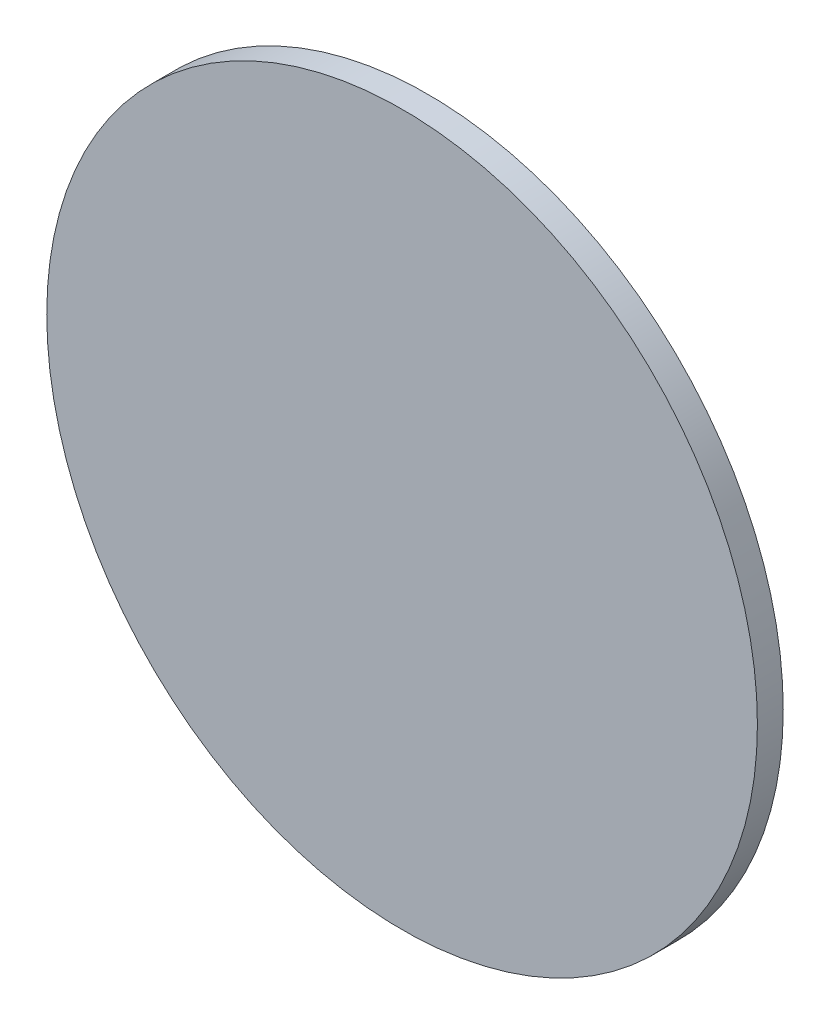
ISO-10303-21;
HEADER;
FILE_DESCRIPTION(('STEP AP214'),'2;1');
FILE_NAME('part.step','',(''),(''),'','','');
FILE_SCHEMA(('AUTOMOTIVE_DESIGN { 1 0 10303 214 1 1 1 1 }'));
ENDSEC;
DATA;
#1=APPLICATION_CONTEXT('core data for automotive mechanical design processes');
#2=APPLICATION_PROTOCOL_DEFINITION('international standard','automotive_design',2000,#1);
#3=PRODUCT_CONTEXT('',#1,'mechanical');
#4=PRODUCT('Part','Part','',(#3));
#5=PRODUCT_RELATED_PRODUCT_CATEGORY('part','',(#4));
#6=PRODUCT_DEFINITION_FORMATION('','',#4);
#7=PRODUCT_DEFINITION_CONTEXT('part definition',#1,'design');
#8=PRODUCT_DEFINITION('design','',#6,#7);
#9=PRODUCT_DEFINITION_SHAPE('','',#8);
#10=(LENGTH_UNIT() NAMED_UNIT(*) SI_UNIT(.MILLI.,.METRE.));
#11=(NAMED_UNIT(*) PLANE_ANGLE_UNIT() SI_UNIT($,.RADIAN.));
#12=(NAMED_UNIT(*) SI_UNIT($,.STERADIAN.) SOLID_ANGLE_UNIT());
#13=UNCERTAINTY_MEASURE_WITH_UNIT(LENGTH_MEASURE(1.E-05),#10,'distance_accuracy_value','');
#14=(GEOMETRIC_REPRESENTATION_CONTEXT(3) GLOBAL_UNCERTAINTY_ASSIGNED_CONTEXT((#13)) GLOBAL_UNIT_ASSIGNED_CONTEXT((#10,
#11,#12)) REPRESENTATION_CONTEXT('',''));
#15=CARTESIAN_POINT('',(0.,0.,0.));
#16=DIRECTION('',(0.,0.,1.));
#17=DIRECTION('',(1.,0.,0.));
#18=AXIS2_PLACEMENT_3D('',#15,#16,#17);
#19=CARTESIAN_POINT('',(0.,0.,6.));
#20=DIRECTION('',(0.,0.,-1.));
#21=DIRECTION('',(-1.,0.,0.));
#22=AXIS2_PLACEMENT_3D('',#19,#20,#21);
#23=CYLINDRICAL_SURFACE('',#22,82.55);
#24=CARTESIAN_POINT('',(0.,0.,6.));
#25=DIRECTION('',(0.,0.,1.));
#26=DIRECTION('',(1.,0.,0.));
#27=AXIS2_PLACEMENT_3D('',#24,#25,#26);
#28=CIRCLE('',#27,82.55);
#29=CARTESIAN_POINT('',(82.55,0.,6.));
#30=VERTEX_POINT('',#29);
#31=EDGE_CURVE('E10',#30,#30,#28,.T.);
#32=ORIENTED_EDGE('',*,*,#31,.F.);
#33=EDGE_LOOP('',(#32));
#34=FACE_BOUND('',#33,.T.);
#35=CARTESIAN_POINT('',(0.,0.,0.));
#36=DIRECTION('',(0.,0.,1.));
#37=DIRECTION('',(1.,0.,0.));
#38=AXIS2_PLACEMENT_3D('',#35,#36,#37);
#39=CIRCLE('',#38,82.55);
#40=CARTESIAN_POINT('',(82.55,0.,0.));
#41=VERTEX_POINT('',#40);
#42=EDGE_CURVE('E34',#41,#41,#39,.T.);
#43=ORIENTED_EDGE('',*,*,#42,.T.);
#44=EDGE_LOOP('',(#43));
#45=FACE_BOUND('',#44,.T.);
#46=ADVANCED_FACE('F31',(#34,#45),#23,.T.);
#47=CARTESIAN_POINT('',(0.,0.,6.));
#48=DIRECTION('',(0.,0.,1.));
#49=DIRECTION('',(1.,0.,0.));
#50=AXIS2_PLACEMENT_3D('',#47,#48,#49);
#51=PLANE('',#50);
#52=ORIENTED_EDGE('',*,*,#31,.T.);
#53=EDGE_LOOP('',(#52));
#54=FACE_BOUND('',#53,.T.);
#55=ADVANCED_FACE('F46',(#54),#51,.T.);
#56=CARTESIAN_POINT('',(0.,0.,0.));
#57=DIRECTION('',(0.,0.,1.));
#58=DIRECTION('',(1.,0.,0.));
#59=AXIS2_PLACEMENT_3D('',#56,#57,#58);
#60=PLANE('',#59);
#61=ORIENTED_EDGE('',*,*,#42,.F.);
#62=EDGE_LOOP('',(#61));
#63=FACE_BOUND('',#62,.T.);
#64=ADVANCED_FACE('F44',(#63),#60,.F.);
#65=CLOSED_SHELL('',(#46,#55,#64));
#66=MANIFOLD_SOLID_BREP('B2',#65);
#67=ADVANCED_BREP_SHAPE_REPRESENTATION('',(#18,#66),#14);
#68=SHAPE_DEFINITION_REPRESENTATION(#9,#67);
ENDSEC;
END-ISO-10303-21;
